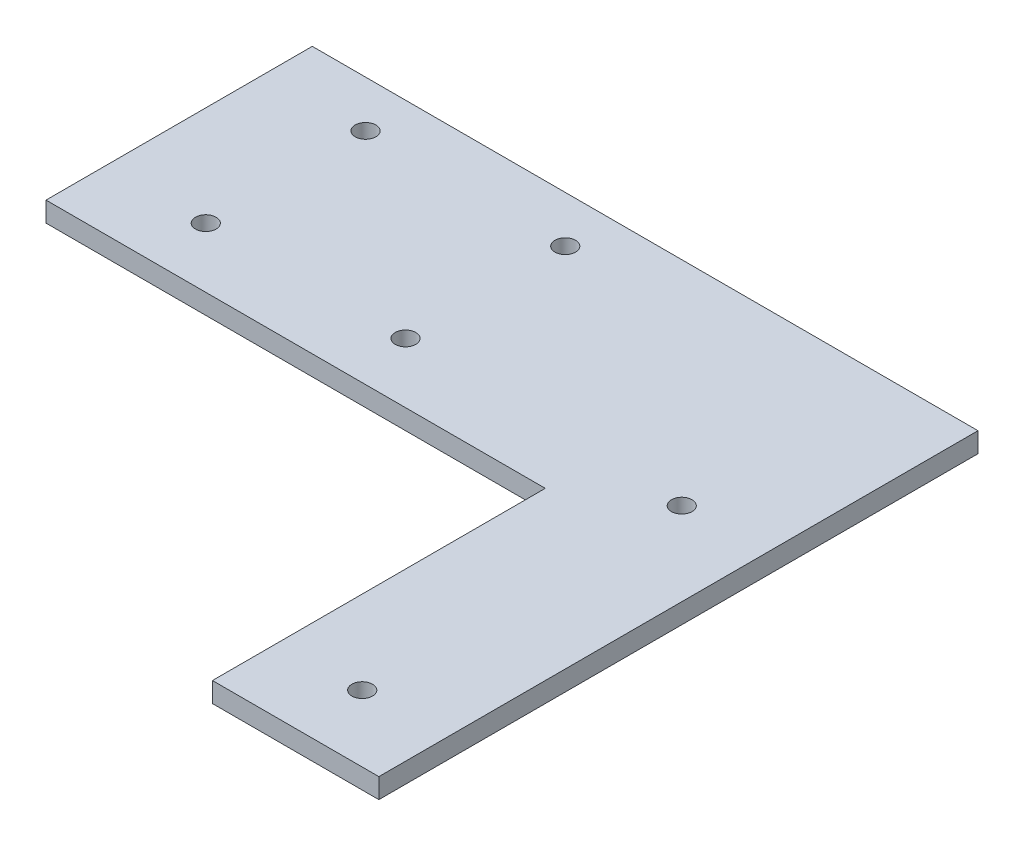
ISO-10303-21;
HEADER;
FILE_DESCRIPTION(('STEP AP214'),'2;1');
FILE_NAME('part.step','',(''),(''),'','','');
FILE_SCHEMA(('AUTOMOTIVE_DESIGN { 1 0 10303 214 1 1 1 1 }'));
ENDSEC;
DATA;
#1=APPLICATION_CONTEXT('core data for automotive mechanical design processes');
#2=APPLICATION_PROTOCOL_DEFINITION('international standard','automotive_design',2000,#1);
#3=PRODUCT_CONTEXT('',#1,'mechanical');
#4=PRODUCT('Part','Part','',(#3));
#5=PRODUCT_RELATED_PRODUCT_CATEGORY('part','',(#4));
#6=PRODUCT_DEFINITION_FORMATION('','',#4);
#7=PRODUCT_DEFINITION_CONTEXT('part definition',#1,'design');
#8=PRODUCT_DEFINITION('design','',#6,#7);
#9=PRODUCT_DEFINITION_SHAPE('','',#8);
#10=(LENGTH_UNIT() NAMED_UNIT(*) SI_UNIT(.MILLI.,.METRE.));
#11=(NAMED_UNIT(*) PLANE_ANGLE_UNIT() SI_UNIT($,.RADIAN.));
#12=(NAMED_UNIT(*) SI_UNIT($,.STERADIAN.) SOLID_ANGLE_UNIT());
#13=UNCERTAINTY_MEASURE_WITH_UNIT(LENGTH_MEASURE(1.E-05),#10,'distance_accuracy_value','');
#14=(GEOMETRIC_REPRESENTATION_CONTEXT(3) GLOBAL_UNCERTAINTY_ASSIGNED_CONTEXT((#13)) GLOBAL_UNIT_ASSIGNED_CONTEXT((#10,
#11,#12)) REPRESENTATION_CONTEXT('',''));
#15=CARTESIAN_POINT('',(0.,0.,0.));
#16=DIRECTION('',(0.,0.,1.));
#17=DIRECTION('',(1.,0.,0.));
#18=AXIS2_PLACEMENT_3D('',#15,#16,#17);
#19=CARTESIAN_POINT('',(25.,3.,0.));
#20=DIRECTION('',(-1.,0.,0.));
#21=DIRECTION('',(0.,0.,1.));
#22=AXIS2_PLACEMENT_3D('',#19,#20,#21);
#23=PLANE('',#22);
#24=DIRECTION('',(0.,0.,-1.));
#25=VECTOR('',#24,1.);
#26=CARTESIAN_POINT('',(25.,0.,0.));
#27=LINE('',#26,#25);
#28=CARTESIAN_POINT('',(25.,0.,45.));
#29=VERTEX_POINT('',#28);
#30=CARTESIAN_POINT('',(25.,0.,-5.00000000000001));
#31=VERTEX_POINT('',#30);
#32=EDGE_CURVE('E119',#29,#31,#27,.T.);
#33=ORIENTED_EDGE('',*,*,#32,.F.);
#34=DIRECTION('',(0.,-1.,0.));
#35=VECTOR('',#34,1.);
#36=CARTESIAN_POINT('',(25.,3.,45.));
#37=LINE('',#36,#35);
#38=CARTESIAN_POINT('',(25.,3.,45.));
#39=VERTEX_POINT('',#38);
#40=EDGE_CURVE('E11',#39,#29,#37,.T.);
#41=ORIENTED_EDGE('',*,*,#40,.F.);
#42=DIRECTION('',(0.,0.,-1.));
#43=VECTOR('',#42,1.);
#44=CARTESIAN_POINT('',(25.,3.,0.));
#45=LINE('',#44,#43);
#46=CARTESIAN_POINT('',(25.,3.,-5.00000000000001));
#47=VERTEX_POINT('',#46);
#48=EDGE_CURVE('E133',#39,#47,#45,.T.);
#49=ORIENTED_EDGE('',*,*,#48,.T.);
#50=DIRECTION('',(0.,-1.,0.));
#51=VECTOR('',#50,1.);
#52=CARTESIAN_POINT('',(25.,3.,-5.00000000000001));
#53=LINE('',#52,#51);
#54=EDGE_CURVE('E81',#47,#31,#53,.T.);
#55=ORIENTED_EDGE('',*,*,#54,.T.);
#56=EDGE_LOOP('',(#33,#41,#49,#55));
#57=FACE_BOUND('',#56,.T.);
#58=ADVANCED_FACE('F37',(#57),#23,.T.);
#59=CARTESIAN_POINT('',(0.,3.,45.));
#60=DIRECTION('',(0.,0.,-1.));
#61=DIRECTION('',(-1.,0.,0.));
#62=AXIS2_PLACEMENT_3D('',#59,#60,#61);
#63=PLANE('',#62);
#64=DIRECTION('',(1.,0.,0.));
#65=VECTOR('',#64,1.);
#66=CARTESIAN_POINT('',(0.,0.,45.));
#67=LINE('',#66,#65);
#68=CARTESIAN_POINT('',(50.,0.,45.));
#69=VERTEX_POINT('',#68);
#70=EDGE_CURVE('E122',#29,#69,#67,.T.);
#71=ORIENTED_EDGE('',*,*,#70,.T.);
#72=DIRECTION('',(0.,-1.,0.));
#73=VECTOR('',#72,1.);
#74=CARTESIAN_POINT('',(50.,3.,45.));
#75=LINE('',#74,#73);
#76=CARTESIAN_POINT('',(50.,3.,45.));
#77=VERTEX_POINT('',#76);
#78=EDGE_CURVE('E45',#77,#69,#75,.T.);
#79=ORIENTED_EDGE('',*,*,#78,.F.);
#80=DIRECTION('',(1.,0.,0.));
#81=VECTOR('',#80,1.);
#82=CARTESIAN_POINT('',(0.,3.,45.));
#83=LINE('',#82,#81);
#84=EDGE_CURVE('E114',#39,#77,#83,.T.);
#85=ORIENTED_EDGE('',*,*,#84,.F.);
#86=ORIENTED_EDGE('',*,*,#40,.T.);
#87=EDGE_LOOP('',(#71,#79,#85,#86));
#88=FACE_BOUND('',#87,.T.);
#89=ADVANCED_FACE('F142',(#88),#63,.F.);
#90=CARTESIAN_POINT('',(50.,3.,0.));
#91=DIRECTION('',(1.,0.,0.));
#92=DIRECTION('',(0.,0.,-1.));
#93=AXIS2_PLACEMENT_3D('',#90,#91,#92);
#94=PLANE('',#93);
#95=DIRECTION('',(0.,0.,1.));
#96=VECTOR('',#95,1.);
#97=CARTESIAN_POINT('',(50.,0.,0.));
#98=LINE('',#97,#96);
#99=CARTESIAN_POINT('',(50.,0.,-45.));
#100=VERTEX_POINT('',#99);
#101=EDGE_CURVE('E126',#100,#69,#98,.T.);
#102=ORIENTED_EDGE('',*,*,#101,.F.);
#103=DIRECTION('',(0.,-1.,0.));
#104=VECTOR('',#103,1.);
#105=CARTESIAN_POINT('',(50.,3.,-45.));
#106=LINE('',#105,#104);
#107=CARTESIAN_POINT('',(50.,3.,-45.));
#108=VERTEX_POINT('',#107);
#109=EDGE_CURVE('E103',#108,#100,#106,.T.);
#110=ORIENTED_EDGE('',*,*,#109,.F.);
#111=DIRECTION('',(0.,0.,1.));
#112=VECTOR('',#111,1.);
#113=CARTESIAN_POINT('',(50.,3.,0.));
#114=LINE('',#113,#112);
#115=EDGE_CURVE('E112',#108,#77,#114,.T.);
#116=ORIENTED_EDGE('',*,*,#115,.T.);
#117=ORIENTED_EDGE('',*,*,#78,.T.);
#118=EDGE_LOOP('',(#102,#110,#116,#117));
#119=FACE_BOUND('',#118,.T.);
#120=ADVANCED_FACE('F139',(#119),#94,.T.);
#121=CARTESIAN_POINT('',(0.,3.,-45.));
#122=DIRECTION('',(0.,0.,-1.));
#123=DIRECTION('',(-1.,0.,0.));
#124=AXIS2_PLACEMENT_3D('',#121,#122,#123);
#125=PLANE('',#124);
#126=DIRECTION('',(1.,0.,0.));
#127=VECTOR('',#126,1.);
#128=CARTESIAN_POINT('',(0.,0.,-45.));
#129=LINE('',#128,#127);
#130=CARTESIAN_POINT('',(-50.,0.,-45.));
#131=VERTEX_POINT('',#130);
#132=EDGE_CURVE('E102',#131,#100,#129,.T.);
#133=ORIENTED_EDGE('',*,*,#132,.F.);
#134=DIRECTION('',(0.,-1.,0.));
#135=VECTOR('',#134,1.);
#136=CARTESIAN_POINT('',(-50.,3.,-45.));
#137=LINE('',#136,#135);
#138=CARTESIAN_POINT('',(-50.,3.,-45.));
#139=VERTEX_POINT('',#138);
#140=EDGE_CURVE('E96',#139,#131,#137,.T.);
#141=ORIENTED_EDGE('',*,*,#140,.F.);
#142=DIRECTION('',(1.,0.,0.));
#143=VECTOR('',#142,1.);
#144=CARTESIAN_POINT('',(0.,3.,-45.));
#145=LINE('',#144,#143);
#146=EDGE_CURVE('E100',#139,#108,#145,.T.);
#147=ORIENTED_EDGE('',*,*,#146,.T.);
#148=ORIENTED_EDGE('',*,*,#109,.T.);
#149=EDGE_LOOP('',(#133,#141,#147,#148));
#150=FACE_BOUND('',#149,.T.);
#151=ADVANCED_FACE('F98',(#150),#125,.T.);
#152=CARTESIAN_POINT('',(-50.,3.,0.));
#153=DIRECTION('',(1.,0.,0.));
#154=DIRECTION('',(0.,0.,-1.));
#155=AXIS2_PLACEMENT_3D('',#152,#153,#154);
#156=PLANE('',#155);
#157=DIRECTION('',(0.,0.,1.));
#158=VECTOR('',#157,1.);
#159=CARTESIAN_POINT('',(-50.,0.,0.));
#160=LINE('',#159,#158);
#161=CARTESIAN_POINT('',(-50.,0.,-5.00000000000001));
#162=VERTEX_POINT('',#161);
#163=EDGE_CURVE('E74',#131,#162,#160,.T.);
#164=ORIENTED_EDGE('',*,*,#163,.T.);
#165=DIRECTION('',(0.,-1.,0.));
#166=VECTOR('',#165,1.);
#167=CARTESIAN_POINT('',(-50.,3.,-5.00000000000001));
#168=LINE('',#167,#166);
#169=CARTESIAN_POINT('',(-50.,3.,-5.00000000000001));
#170=VERTEX_POINT('',#169);
#171=EDGE_CURVE('E104',#170,#162,#168,.T.);
#172=ORIENTED_EDGE('',*,*,#171,.F.);
#173=DIRECTION('',(0.,0.,1.));
#174=VECTOR('',#173,1.);
#175=CARTESIAN_POINT('',(-50.,3.,0.));
#176=LINE('',#175,#174);
#177=EDGE_CURVE('E106',#139,#170,#176,.T.);
#178=ORIENTED_EDGE('',*,*,#177,.F.);
#179=ORIENTED_EDGE('',*,*,#140,.T.);
#180=EDGE_LOOP('',(#164,#172,#178,#179));
#181=FACE_BOUND('',#180,.T.);
#182=ADVANCED_FACE('F107',(#181),#156,.F.);
#183=CARTESIAN_POINT('',(0.,3.,-5.00000000000001));
#184=DIRECTION('',(0.,0.,-1.));
#185=DIRECTION('',(-1.,0.,0.));
#186=AXIS2_PLACEMENT_3D('',#183,#184,#185);
#187=PLANE('',#186);
#188=DIRECTION('',(1.,0.,0.));
#189=VECTOR('',#188,1.);
#190=CARTESIAN_POINT('',(0.,0.,-5.00000000000001));
#191=LINE('',#190,#189);
#192=EDGE_CURVE('E131',#162,#31,#191,.T.);
#193=ORIENTED_EDGE('',*,*,#192,.T.);
#194=ORIENTED_EDGE('',*,*,#54,.F.);
#195=DIRECTION('',(1.,0.,0.));
#196=VECTOR('',#195,1.);
#197=CARTESIAN_POINT('',(0.,3.,-5.00000000000001));
#198=LINE('',#197,#196);
#199=EDGE_CURVE('E53',#170,#47,#198,.T.);
#200=ORIENTED_EDGE('',*,*,#199,.F.);
#201=ORIENTED_EDGE('',*,*,#171,.T.);
#202=EDGE_LOOP('',(#193,#194,#200,#201));
#203=FACE_BOUND('',#202,.T.);
#204=ADVANCED_FACE('F147',(#203),#187,.F.);
#205=CARTESIAN_POINT('',(0.,3.,0.));
#206=DIRECTION('',(0.,1.,0.));
#207=DIRECTION('',(0.,0.,1.));
#208=AXIS2_PLACEMENT_3D('',#205,#206,#207);
#209=PLANE('',#208);
#210=CARTESIAN_POINT('',(37.5,3.,-13.0000000000001));
#211=DIRECTION('',(0.,1.,0.));
#212=DIRECTION('',(0.,0.,1.));
#213=AXIS2_PLACEMENT_3D('',#210,#211,#212);
#214=CIRCLE('',#213,1.55);
#215=CARTESIAN_POINT('',(37.5,3.,-11.4500000000001));
#216=VERTEX_POINT('',#215);
#217=EDGE_CURVE('E173',#216,#216,#214,.T.);
#218=ORIENTED_EDGE('',*,*,#217,.F.);
#219=EDGE_LOOP('',(#218));
#220=FACE_BOUND('',#219,.T.);
#221=CARTESIAN_POINT('',(37.5,3.,34.9999999999999));
#222=DIRECTION('',(0.,1.,0.));
#223=DIRECTION('',(0.,0.,1.));
#224=AXIS2_PLACEMENT_3D('',#221,#222,#223);
#225=CIRCLE('',#224,1.54999999999999);
#226=CARTESIAN_POINT('',(37.5,3.,36.5499999999999));
#227=VERTEX_POINT('',#226);
#228=EDGE_CURVE('E176',#227,#227,#225,.T.);
#229=ORIENTED_EDGE('',*,*,#228,.F.);
#230=EDGE_LOOP('',(#229));
#231=FACE_BOUND('',#230,.T.);
#232=CARTESIAN_POINT('',(-4.99999999999993,3.,-14.0000000000003));
#233=DIRECTION('',(0.,1.,0.));
#234=DIRECTION('',(0.,0.,1.));
#235=AXIS2_PLACEMENT_3D('',#232,#233,#234);
#236=CIRCLE('',#235,1.55);
#237=CARTESIAN_POINT('',(-4.99999999999993,3.,-12.4500000000002));
#238=VERTEX_POINT('',#237);
#239=EDGE_CURVE('E123',#238,#238,#236,.T.);
#240=ORIENTED_EDGE('',*,*,#239,.F.);
#241=EDGE_LOOP('',(#240));
#242=FACE_BOUND('',#241,.T.);
#243=CARTESIAN_POINT('',(-34.9999999999999,3.,-38.0000000000002));
#244=DIRECTION('',(0.,1.,0.));
#245=DIRECTION('',(0.,0.,1.));
#246=AXIS2_PLACEMENT_3D('',#243,#244,#245);
#247=CIRCLE('',#246,1.54999999999999);
#248=CARTESIAN_POINT('',(-34.9999999999999,3.,-36.4500000000003));
#249=VERTEX_POINT('',#248);
#250=EDGE_CURVE('E152',#249,#249,#247,.T.);
#251=ORIENTED_EDGE('',*,*,#250,.F.);
#252=EDGE_LOOP('',(#251));
#253=FACE_BOUND('',#252,.T.);
#254=CARTESIAN_POINT('',(-34.9999999999999,3.,-14.0000000000002));
#255=DIRECTION('',(0.,1.,0.));
#256=DIRECTION('',(0.,0.,1.));
#257=AXIS2_PLACEMENT_3D('',#254,#255,#256);
#258=CIRCLE('',#257,1.55);
#259=CARTESIAN_POINT('',(-34.9999999999999,3.,-12.4500000000002));
#260=VERTEX_POINT('',#259);
#261=EDGE_CURVE('E155',#260,#260,#258,.T.);
#262=ORIENTED_EDGE('',*,*,#261,.F.);
#263=EDGE_LOOP('',(#262));
#264=FACE_BOUND('',#263,.T.);
#265=CARTESIAN_POINT('',(-4.99999999999994,3.,-38.0000000000003));
#266=DIRECTION('',(0.,1.,0.));
#267=DIRECTION('',(0.,0.,1.));
#268=AXIS2_PLACEMENT_3D('',#265,#266,#267);
#269=CIRCLE('',#268,1.55);
#270=CARTESIAN_POINT('',(-4.99999999999994,3.,-36.4500000000003));
#271=VERTEX_POINT('',#270);
#272=EDGE_CURVE('E158',#271,#271,#269,.T.);
#273=ORIENTED_EDGE('',*,*,#272,.F.);
#274=EDGE_LOOP('',(#273));
#275=FACE_BOUND('',#274,.T.);
#276=ORIENTED_EDGE('',*,*,#48,.F.);
#277=ORIENTED_EDGE('',*,*,#84,.T.);
#278=ORIENTED_EDGE('',*,*,#115,.F.);
#279=ORIENTED_EDGE('',*,*,#146,.F.);
#280=ORIENTED_EDGE('',*,*,#177,.T.);
#281=ORIENTED_EDGE('',*,*,#199,.T.);
#282=EDGE_LOOP('',(#276,#277,#278,#279,#280,#281));
#283=FACE_BOUND('',#282,.T.);
#284=ADVANCED_FACE('F110',(#220,#231,#242,#253,#264,#275,#283),#209,.T.);
#285=CARTESIAN_POINT('',(0.,0.,0.));
#286=DIRECTION('',(0.,1.,0.));
#287=DIRECTION('',(0.,0.,1.));
#288=AXIS2_PLACEMENT_3D('',#285,#286,#287);
#289=PLANE('',#288);
#290=CARTESIAN_POINT('',(37.5,0.,-13.0000000000001));
#291=DIRECTION('',(0.,-1.,0.));
#292=DIRECTION('',(0.,0.,-1.));
#293=AXIS2_PLACEMENT_3D('',#290,#291,#292);
#294=CIRCLE('',#293,1.55);
#295=CARTESIAN_POINT('',(37.5,0.,-14.5500000000001));
#296=VERTEX_POINT('',#295);
#297=EDGE_CURVE('E179',#296,#296,#294,.T.);
#298=ORIENTED_EDGE('',*,*,#297,.F.);
#299=EDGE_LOOP('',(#298));
#300=FACE_BOUND('',#299,.T.);
#301=CARTESIAN_POINT('',(37.5,0.,34.9999999999999));
#302=DIRECTION('',(0.,-1.,0.));
#303=DIRECTION('',(0.,0.,-1.));
#304=AXIS2_PLACEMENT_3D('',#301,#302,#303);
#305=CIRCLE('',#304,1.54999999999999);
#306=CARTESIAN_POINT('',(37.5,0.,33.4499999999999));
#307=VERTEX_POINT('',#306);
#308=EDGE_CURVE('E180',#307,#307,#305,.T.);
#309=ORIENTED_EDGE('',*,*,#308,.F.);
#310=EDGE_LOOP('',(#309));
#311=FACE_BOUND('',#310,.T.);
#312=CARTESIAN_POINT('',(-4.99999999999993,0.,-14.0000000000003));
#313=DIRECTION('',(0.,-1.,0.));
#314=DIRECTION('',(0.,0.,-1.));
#315=AXIS2_PLACEMENT_3D('',#312,#313,#314);
#316=CIRCLE('',#315,1.55);
#317=CARTESIAN_POINT('',(-4.99999999999993,0.,-15.5500000000003));
#318=VERTEX_POINT('',#317);
#319=EDGE_CURVE('E164',#318,#318,#316,.T.);
#320=ORIENTED_EDGE('',*,*,#319,.F.);
#321=EDGE_LOOP('',(#320));
#322=FACE_BOUND('',#321,.T.);
#323=CARTESIAN_POINT('',(-34.9999999999999,0.,-38.0000000000002));
#324=DIRECTION('',(0.,-1.,0.));
#325=DIRECTION('',(0.,0.,-1.));
#326=AXIS2_PLACEMENT_3D('',#323,#324,#325);
#327=CIRCLE('',#326,1.54999999999999);
#328=CARTESIAN_POINT('',(-34.9999999999999,0.,-39.5500000000002));
#329=VERTEX_POINT('',#328);
#330=EDGE_CURVE('E165',#329,#329,#327,.T.);
#331=ORIENTED_EDGE('',*,*,#330,.F.);
#332=EDGE_LOOP('',(#331));
#333=FACE_BOUND('',#332,.T.);
#334=CARTESIAN_POINT('',(-34.9999999999999,0.,-14.0000000000002));
#335=DIRECTION('',(0.,-1.,0.));
#336=DIRECTION('',(0.,0.,-1.));
#337=AXIS2_PLACEMENT_3D('',#334,#335,#336);
#338=CIRCLE('',#337,1.55);
#339=CARTESIAN_POINT('',(-34.9999999999999,0.,-15.5500000000002));
#340=VERTEX_POINT('',#339);
#341=EDGE_CURVE('E168',#340,#340,#338,.T.);
#342=ORIENTED_EDGE('',*,*,#341,.F.);
#343=EDGE_LOOP('',(#342));
#344=FACE_BOUND('',#343,.T.);
#345=CARTESIAN_POINT('',(-4.99999999999994,0.,-38.0000000000003));
#346=DIRECTION('',(0.,-1.,0.));
#347=DIRECTION('',(0.,0.,-1.));
#348=AXIS2_PLACEMENT_3D('',#345,#346,#347);
#349=CIRCLE('',#348,1.55);
#350=CARTESIAN_POINT('',(-4.99999999999994,0.,-39.5500000000003));
#351=VERTEX_POINT('',#350);
#352=EDGE_CURVE('E161',#351,#351,#349,.T.);
#353=ORIENTED_EDGE('',*,*,#352,.F.);
#354=EDGE_LOOP('',(#353));
#355=FACE_BOUND('',#354,.T.);
#356=ORIENTED_EDGE('',*,*,#32,.T.);
#357=ORIENTED_EDGE('',*,*,#192,.F.);
#358=ORIENTED_EDGE('',*,*,#163,.F.);
#359=ORIENTED_EDGE('',*,*,#132,.T.);
#360=ORIENTED_EDGE('',*,*,#101,.T.);
#361=ORIENTED_EDGE('',*,*,#70,.F.);
#362=EDGE_LOOP('',(#356,#357,#358,#359,#360,#361));
#363=FACE_BOUND('',#362,.T.);
#364=ADVANCED_FACE('F144',(#300,#311,#322,#333,#344,#355,#363),#289,.F.);
#365=CARTESIAN_POINT('',(-4.99999999999994,10.,-38.0000000000003));
#366=DIRECTION('',(0.,-1.,0.));
#367=DIRECTION('',(0.,0.,-1.));
#368=AXIS2_PLACEMENT_3D('',#365,#366,#367);
#369=CYLINDRICAL_SURFACE('',#368,1.55);
#370=ORIENTED_EDGE('',*,*,#272,.T.);
#371=EDGE_LOOP('',(#370));
#372=FACE_BOUND('',#371,.T.);
#373=ORIENTED_EDGE('',*,*,#352,.T.);
#374=EDGE_LOOP('',(#373));
#375=FACE_BOUND('',#374,.T.);
#376=ADVANCED_FACE('F190',(#372,#375),#369,.F.);
#377=CARTESIAN_POINT('',(-34.9999999999999,10.,-14.0000000000002));
#378=DIRECTION('',(0.,-1.,0.));
#379=DIRECTION('',(0.,0.,-1.));
#380=AXIS2_PLACEMENT_3D('',#377,#378,#379);
#381=CYLINDRICAL_SURFACE('',#380,1.55);
#382=ORIENTED_EDGE('',*,*,#261,.T.);
#383=EDGE_LOOP('',(#382));
#384=FACE_BOUND('',#383,.T.);
#385=ORIENTED_EDGE('',*,*,#341,.T.);
#386=EDGE_LOOP('',(#385));
#387=FACE_BOUND('',#386,.T.);
#388=ADVANCED_FACE('F203',(#384,#387),#381,.F.);
#389=CARTESIAN_POINT('',(-34.9999999999999,10.,-38.0000000000002));
#390=DIRECTION('',(0.,-1.,0.));
#391=DIRECTION('',(0.,0.,-1.));
#392=AXIS2_PLACEMENT_3D('',#389,#390,#391);
#393=CYLINDRICAL_SURFACE('',#392,1.54999999999999);
#394=ORIENTED_EDGE('',*,*,#250,.T.);
#395=EDGE_LOOP('',(#394));
#396=FACE_BOUND('',#395,.T.);
#397=ORIENTED_EDGE('',*,*,#330,.T.);
#398=EDGE_LOOP('',(#397));
#399=FACE_BOUND('',#398,.T.);
#400=ADVANCED_FACE('F209',(#396,#399),#393,.F.);
#401=CARTESIAN_POINT('',(-4.99999999999993,10.,-14.0000000000003));
#402=DIRECTION('',(0.,-1.,0.));
#403=DIRECTION('',(0.,0.,-1.));
#404=AXIS2_PLACEMENT_3D('',#401,#402,#403);
#405=CYLINDRICAL_SURFACE('',#404,1.55);
#406=ORIENTED_EDGE('',*,*,#239,.T.);
#407=EDGE_LOOP('',(#406));
#408=FACE_BOUND('',#407,.T.);
#409=ORIENTED_EDGE('',*,*,#319,.T.);
#410=EDGE_LOOP('',(#409));
#411=FACE_BOUND('',#410,.T.);
#412=ADVANCED_FACE('F247',(#408,#411),#405,.F.);
#413=CARTESIAN_POINT('',(37.5,10.,34.9999999999999));
#414=DIRECTION('',(0.,-1.,0.));
#415=DIRECTION('',(0.,0.,-1.));
#416=AXIS2_PLACEMENT_3D('',#413,#414,#415);
#417=CYLINDRICAL_SURFACE('',#416,1.54999999999999);
#418=ORIENTED_EDGE('',*,*,#228,.T.);
#419=EDGE_LOOP('',(#418));
#420=FACE_BOUND('',#419,.T.);
#421=ORIENTED_EDGE('',*,*,#308,.T.);
#422=EDGE_LOOP('',(#421));
#423=FACE_BOUND('',#422,.T.);
#424=ADVANCED_FACE('F251',(#420,#423),#417,.F.);
#425=CARTESIAN_POINT('',(37.5,10.,-13.0000000000001));
#426=DIRECTION('',(0.,-1.,0.));
#427=DIRECTION('',(0.,0.,-1.));
#428=AXIS2_PLACEMENT_3D('',#425,#426,#427);
#429=CYLINDRICAL_SURFACE('',#428,1.55);
#430=ORIENTED_EDGE('',*,*,#217,.T.);
#431=EDGE_LOOP('',(#430));
#432=FACE_BOUND('',#431,.T.);
#433=ORIENTED_EDGE('',*,*,#297,.T.);
#434=EDGE_LOOP('',(#433));
#435=FACE_BOUND('',#434,.T.);
#436=ADVANCED_FACE('F186',(#432,#435),#429,.F.);
#437=CLOSED_SHELL('',(#58,#89,#120,#151,#182,#204,#284,#364,#376,#388,#400,#412,#424,#436));
#438=MANIFOLD_SOLID_BREP('B2',#437);
#439=ADVANCED_BREP_SHAPE_REPRESENTATION('',(#18,#438),#14);
#440=SHAPE_DEFINITION_REPRESENTATION(#9,#439);
ENDSEC;
END-ISO-10303-21;
